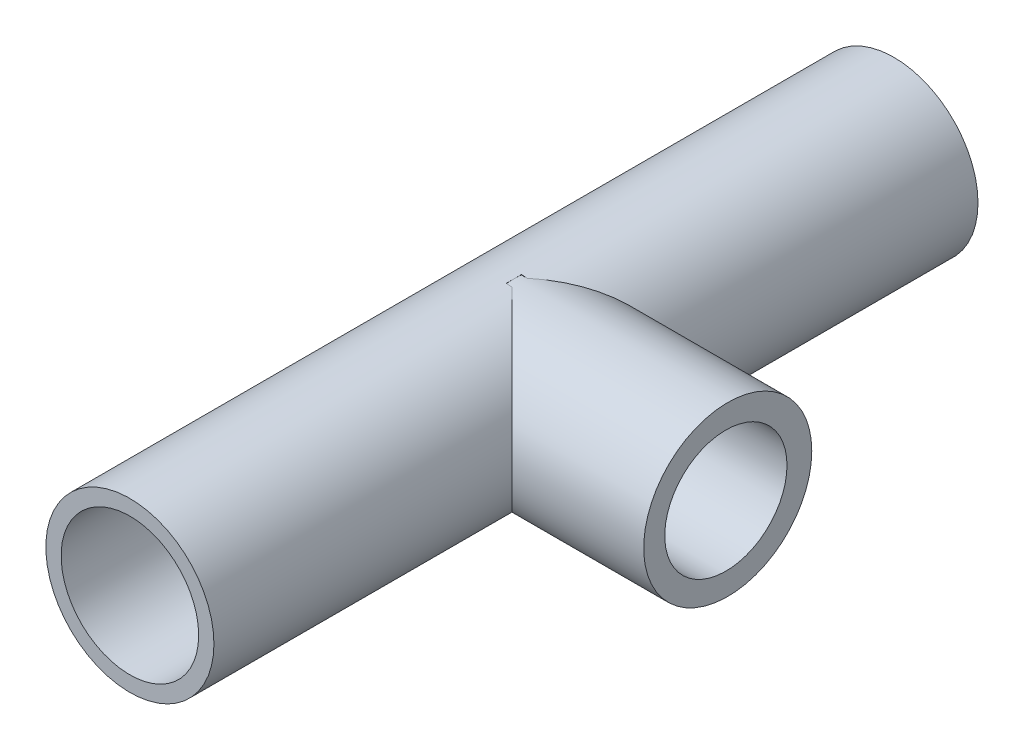
ISO-10303-21;
HEADER;
FILE_DESCRIPTION(('STEP AP214'),'2;1');
FILE_NAME('part.step','',(''),(''),'','','');
FILE_SCHEMA(('AUTOMOTIVE_DESIGN { 1 0 10303 214 1 1 1 1 }'));
ENDSEC;
DATA;
#1=APPLICATION_CONTEXT('core data for automotive mechanical design processes');
#2=APPLICATION_PROTOCOL_DEFINITION('international standard','automotive_design',2000,#1);
#3=PRODUCT_CONTEXT('',#1,'mechanical');
#4=PRODUCT('Part','Part','',(#3));
#5=PRODUCT_RELATED_PRODUCT_CATEGORY('part','',(#4));
#6=PRODUCT_DEFINITION_FORMATION('','',#4);
#7=PRODUCT_DEFINITION_CONTEXT('part definition',#1,'design');
#8=PRODUCT_DEFINITION('design','',#6,#7);
#9=PRODUCT_DEFINITION_SHAPE('','',#8);
#10=(LENGTH_UNIT() NAMED_UNIT(*) SI_UNIT(.MILLI.,.METRE.));
#11=(NAMED_UNIT(*) PLANE_ANGLE_UNIT() SI_UNIT($,.RADIAN.));
#12=(NAMED_UNIT(*) SI_UNIT($,.STERADIAN.) SOLID_ANGLE_UNIT());
#13=UNCERTAINTY_MEASURE_WITH_UNIT(LENGTH_MEASURE(1.E-05),#10,'distance_accuracy_value','');
#14=(GEOMETRIC_REPRESENTATION_CONTEXT(3) GLOBAL_UNCERTAINTY_ASSIGNED_CONTEXT((#13)) GLOBAL_UNIT_ASSIGNED_CONTEXT((#10,
#11,#12)) REPRESENTATION_CONTEXT('',''));
#15=CARTESIAN_POINT('',(0.,0.,0.));
#16=DIRECTION('',(0.,0.,1.));
#17=DIRECTION('',(1.,0.,0.));
#18=AXIS2_PLACEMENT_3D('',#15,#16,#17);
#19=CARTESIAN_POINT('',(0.,0.,100.));
#20=DIRECTION('',(0.,0.,-1.));
#21=DIRECTION('',(-1.,0.,0.));
#22=AXIS2_PLACEMENT_3D('',#19,#20,#21);
#23=CYLINDRICAL_SURFACE('',#22,11.);
#24=CARTESIAN_POINT('',(0.,0.,0.));
#25=DIRECTION('',(0.,0.,1.));
#26=DIRECTION('',(1.,0.,0.));
#27=AXIS2_PLACEMENT_3D('',#24,#25,#26);
#28=CIRCLE('',#27,11.);
#29=CARTESIAN_POINT('',(11.,0.,0.));
#30=VERTEX_POINT('',#29);
#31=EDGE_CURVE('E133',#30,#30,#28,.T.);
#32=ORIENTED_EDGE('',*,*,#31,.T.);
#33=EDGE_LOOP('',(#32));
#34=FACE_BOUND('',#33,.T.);
#35=CARTESIAN_POINT('',(0.,0.,100.));
#36=DIRECTION('',(0.,0.,1.));
#37=DIRECTION('',(1.,0.,0.));
#38=AXIS2_PLACEMENT_3D('',#35,#36,#37);
#39=CIRCLE('',#38,11.);
#40=CARTESIAN_POINT('',(11.,0.,100.));
#41=VERTEX_POINT('',#40);
#42=EDGE_CURVE('E130',#41,#41,#39,.T.);
#43=ORIENTED_EDGE('',*,*,#42,.F.);
#44=EDGE_LOOP('',(#43));
#45=FACE_BOUND('',#44,.T.);
#46=CARTESIAN_POINT('',(0.,0.,50.));
#47=DIRECTION('',(-0.707106781186547,0.,-0.707106781186547));
#48=DIRECTION('',(0.707106781186547,0.,-0.707106781186547));
#49=AXIS2_PLACEMENT_3D('',#46,#47,#48);
#50=ELLIPSE('',#49,15.556349186104,11.);
#51=CARTESIAN_POINT('',(1.00000000000007,-10.9544511501033,49.));
#52=VERTEX_POINT('',#51);
#53=CARTESIAN_POINT('',(1.00000000000007,10.9544511501033,49.));
#54=VERTEX_POINT('',#53);
#55=EDGE_CURVE('E238',#52,#54,#50,.F.);
#56=ORIENTED_EDGE('',*,*,#55,.F.);
#57=CARTESIAN_POINT('',(0.,0.,49.));
#58=DIRECTION('',(0.,0.,1.));
#59=DIRECTION('',(1.,0.,0.));
#60=AXIS2_PLACEMENT_3D('',#57,#58,#59);
#61=CIRCLE('',#60,11.);
#62=CARTESIAN_POINT('',(0.245082493247842,-10.9972694143366,49.));
#63=VERTEX_POINT('',#62);
#64=EDGE_CURVE('E259',#63,#52,#61,.T.);
#65=ORIENTED_EDGE('',*,*,#64,.F.);
#66=DIRECTION('',(0.,0.,-1.));
#67=VECTOR('',#66,1.);
#68=CARTESIAN_POINT('',(0.245082493247843,-10.9972694143366,100.));
#69=LINE('',#68,#67);
#70=CARTESIAN_POINT('',(0.245082493247843,-10.9972694143366,49.7549175067525));
#71=VERTEX_POINT('',#70);
#72=EDGE_CURVE('E261',#63,#71,#69,.F.);
#73=ORIENTED_EDGE('',*,*,#72,.T.);
#74=CARTESIAN_POINT('',(0.245082493247843,0.,50.));
#75=DIRECTION('',(1.,0.,0.));
#76=DIRECTION('',(0.,-0.999751764939692,0.0222802266588629));
#77=AXIS2_PLACEMENT_3D('',#74,#75,#76);
#78=CIRCLE('',#77,11.);
#79=CARTESIAN_POINT('',(0.245082493247843,-10.9972694143366,50.2450824932475));
#80=VERTEX_POINT('',#79);
#81=EDGE_CURVE('E245',#80,#71,#78,.T.);
#82=ORIENTED_EDGE('',*,*,#81,.F.);
#83=CARTESIAN_POINT('',(0.245082493247842,-10.9972694143366,51.));
#84=VERTEX_POINT('',#83);
#85=EDGE_CURVE('E41',#80,#84,#69,.F.);
#86=ORIENTED_EDGE('',*,*,#85,.T.);
#87=CARTESIAN_POINT('',(0.,0.,51.));
#88=DIRECTION('',(0.,0.,1.));
#89=DIRECTION('',(1.,0.,0.));
#90=AXIS2_PLACEMENT_3D('',#87,#88,#89);
#91=CIRCLE('',#90,11.);
#92=CARTESIAN_POINT('',(1.00000000000007,-10.9544511501033,51.));
#93=VERTEX_POINT('',#92);
#94=EDGE_CURVE('E112',#84,#93,#91,.T.);
#95=ORIENTED_EDGE('',*,*,#94,.T.);
#96=CARTESIAN_POINT('',(0.,0.,50.));
#97=DIRECTION('',(0.707106781186547,0.,-0.707106781186547));
#98=DIRECTION('',(-0.707106781186547,0.,-0.707106781186547));
#99=AXIS2_PLACEMENT_3D('',#96,#97,#98);
#100=ELLIPSE('',#99,15.556349186104,11.);
#101=CARTESIAN_POINT('',(1.00000000000007,10.9544511501033,51.));
#102=VERTEX_POINT('',#101);
#103=EDGE_CURVE('E129',#102,#93,#100,.T.);
#104=ORIENTED_EDGE('',*,*,#103,.F.);
#105=CARTESIAN_POINT('',(0.245082493247842,10.9972694143366,51.));
#106=VERTEX_POINT('',#105);
#107=EDGE_CURVE('E256',#102,#106,#91,.T.);
#108=ORIENTED_EDGE('',*,*,#107,.T.);
#109=DIRECTION('',(0.,0.,-1.));
#110=VECTOR('',#109,1.);
#111=CARTESIAN_POINT('',(0.245082493247843,10.9972694143366,100.));
#112=LINE('',#111,#110);
#113=CARTESIAN_POINT('',(0.245082493247843,10.9972694143366,50.2450824932475));
#114=VERTEX_POINT('',#113);
#115=EDGE_CURVE('E145',#106,#114,#112,.T.);
#116=ORIENTED_EDGE('',*,*,#115,.T.);
#117=CARTESIAN_POINT('',(0.245082493247843,0.,50.));
#118=DIRECTION('',(1.,0.,0.));
#119=DIRECTION('',(0.,0.999751764939692,-0.0222802266588636));
#120=AXIS2_PLACEMENT_3D('',#117,#118,#119);
#121=CIRCLE('',#120,11.);
#122=CARTESIAN_POINT('',(0.245082493247843,10.9972694143366,49.7549175067525));
#123=VERTEX_POINT('',#122);
#124=EDGE_CURVE('E140',#123,#114,#121,.T.);
#125=ORIENTED_EDGE('',*,*,#124,.F.);
#126=CARTESIAN_POINT('',(0.245082493247842,10.9972694143366,49.));
#127=VERTEX_POINT('',#126);
#128=EDGE_CURVE('E55',#123,#127,#112,.T.);
#129=ORIENTED_EDGE('',*,*,#128,.T.);
#130=EDGE_CURVE('E255',#54,#127,#61,.T.);
#131=ORIENTED_EDGE('',*,*,#130,.F.);
#132=EDGE_LOOP('',(#56,#65,#73,#82,#86,#95,#104,#108,#116,#125,#129,#131));
#133=FACE_BOUND('',#132,.T.);
#134=ADVANCED_FACE('F37',(#34,#45,#133),#23,.T.);
#135=CARTESIAN_POINT('',(0.,0.,100.));
#136=DIRECTION('',(0.,0.,-1.));
#137=DIRECTION('',(-1.,0.,0.));
#138=AXIS2_PLACEMENT_3D('',#135,#136,#137);
#139=CYLINDRICAL_SURFACE('',#138,9.);
#140=CARTESIAN_POINT('',(9.,0.,42.2431805977981));
#141=CARTESIAN_POINT('',(8.9999982147557,-0.186012270472923,42.2431824056281));
#142=CARTESIAN_POINT('',(8.99422012657772,-0.372061894134603,42.2496812424511));
#143=CARTESIAN_POINT('',(8.9712315702552,-0.74263329297767,42.2755567260639));
#144=CARTESIAN_POINT('',(8.95401453623935,-0.927154129023269,42.294940768871));
#145=CARTESIAN_POINT('',(8.90849354673416,-1.29338749112095,42.3462572841534));
#146=CARTESIAN_POINT('',(8.88016999644761,-1.47509446056546,42.3782119347878));
#147=CARTESIAN_POINT('',(8.8130298798314,-1.83408642791194,42.4540979685192));
#148=CARTESIAN_POINT('',(8.77420836877132,-2.01136929889185,42.4980349956166));
#149=CARTESIAN_POINT('',(8.68717642125768,-2.35899028939158,42.5967714110848));
#150=CARTESIAN_POINT('',(8.63903810977974,-2.52937031750564,42.6514874099155));
#151=CARTESIAN_POINT('',(8.53402320683388,-2.86377023574463,42.7712077317572));
#152=CARTESIAN_POINT('',(8.47714277687146,-3.02778729219915,42.8362165745363));
#153=CARTESIAN_POINT('',(8.3555897708379,-3.34866274008045,42.9756468445696));
#154=CARTESIAN_POINT('',(8.29092073648236,-3.5055243409044,43.0500639943399));
#155=CARTESIAN_POINT('',(8.15467355444471,-3.81174485081793,43.2075385912707));
#156=CARTESIAN_POINT('',(8.08309386878562,-3.96110207849971,43.2905979620932));
#157=CARTESIAN_POINT('',(7.90459748615449,-4.30919674417141,43.4988077017555));
#158=CARTESIAN_POINT('',(7.79484824014842,-4.50427420262921,43.6276719662957));
#159=CARTESIAN_POINT('',(7.56602975415553,-4.87887171147667,43.898883183037));
#160=CARTESIAN_POINT('',(7.44696028125135,-5.05839137283245,44.0412304722047));
#161=CARTESIAN_POINT('',(7.20139040924066,-5.40228844634357,44.3383484078678));
#162=CARTESIAN_POINT('',(7.07487257698273,-5.56662781787219,44.4931485379982));
#163=CARTESIAN_POINT('',(6.81684051322006,-5.87978242392109,44.8137809826376));
#164=CARTESIAN_POINT('',(6.68532694799833,-6.02859971877947,44.979611828176));
#165=CARTESIAN_POINT('',(6.41647402575206,-6.31412404131508,45.3255315794351));
#166=CARTESIAN_POINT('',(6.27907017109693,-6.45048248949408,45.5058576138049));
#167=CARTESIAN_POINT('',(6.0038358578962,-6.70741321924818,45.8772195298596));
#168=CARTESIAN_POINT('',(5.86600528614521,-6.82798086347553,46.0682585342459));
#169=CARTESIAN_POINT('',(5.59331804011493,-7.05308210397108,46.4609617805592));
#170=CARTESIAN_POINT('',(5.45845632377875,-7.15764502697451,46.6626056564258));
#171=CARTESIAN_POINT('',(5.19565394661048,-7.3506262141139,47.0776406865542));
#172=CARTESIAN_POINT('',(5.06770849211157,-7.43905576394602,47.2910234920922));
#173=CARTESIAN_POINT('',(4.82328054177641,-7.59983838873876,47.7335001225224));
#174=CARTESIAN_POINT('',(4.70693376045288,-7.67201133089423,47.9627363752648));
#175=CARTESIAN_POINT('',(4.49665140178865,-7.79711987207939,48.436329837394));
#176=CARTESIAN_POINT('',(4.40268313143869,-7.85008359400457,48.6806643236514));
#177=CARTESIAN_POINT('',(4.26273683776934,-7.92681910091217,49.1427757377624));
#178=CARTESIAN_POINT('',(4.21140581460927,-7.95396071910935,49.3583051858002));
#179=CARTESIAN_POINT('',(4.14170765615813,-7.99048956372416,49.7959500959985));
#180=CARTESIAN_POINT('',(4.12326877827652,-7.99991543320198,50.0180501475701));
#181=CARTESIAN_POINT('',(4.12294424617802,-8.00008365418742,50.4628724746577));
#182=CARTESIAN_POINT('',(4.14115666227761,-7.9907758788213,50.6855948229062));
#183=CARTESIAN_POINT('',(4.21062766171909,-7.9543706554487,51.1245121600429));
#184=CARTESIAN_POINT('',(4.26195698473077,-7.92723512402644,51.3406921367396));
#185=CARTESIAN_POINT('',(4.37403768415555,-7.86579906756439,51.7113471681612));
#186=CARTESIAN_POINT('',(4.4294892365735,-7.83482971394289,51.8680773425133));
#187=CARTESIAN_POINT('',(4.55123659764981,-7.7647396230811,52.175450772632));
#188=CARTESIAN_POINT('',(4.61753917620501,-7.72561379285976,52.326090154748));
#189=CARTESIAN_POINT('',(4.75826794283686,-7.63974467714259,52.6218581395557));
#190=CARTESIAN_POINT('',(4.83272003444131,-7.59297685470654,52.7669670704255));
#191=CARTESIAN_POINT('',(4.98729515676827,-7.4923571382937,53.0516261454358));
#192=CARTESIAN_POINT('',(5.06742021459951,-7.43850270611213,53.1911742744264));
#193=CARTESIAN_POINT('',(5.2925492738406,-7.28143204951842,53.5670119536441));
#194=CARTESIAN_POINT('',(5.44149041015919,-7.17129008849775,53.7980716066678));
#195=CARTESIAN_POINT('',(5.7443481588242,-6.93108615361568,54.246264468888));
#196=CARTESIAN_POINT('',(5.89826804465158,-6.80101085475224,54.463388223458));
#197=CARTESIAN_POINT('',(6.20630899033364,-6.52112166227905,54.8841684464979));
#198=CARTESIAN_POINT('',(6.36042991482932,-6.37131746207805,55.0878314553122));
#199=CARTESIAN_POINT('',(6.66519646965124,-6.05176819697834,55.4815324051423));
#200=CARTESIAN_POINT('',(6.81584359895424,-5.88203193316977,55.671576300491));
#201=CARTESIAN_POINT('',(7.08239714846874,-5.55653673634248,56.0023465867928));
#202=CARTESIAN_POINT('',(7.19945976280785,-5.40426344884626,56.1455764287923));
#203=CARTESIAN_POINT('',(7.42750510403212,-5.08629891856154,56.4216829625225));
#204=CARTESIAN_POINT('',(7.53848772852791,-4.92060744992209,56.5545594799152));
#205=CARTESIAN_POINT('',(7.75243686655107,-4.57610909419838,56.8086171217953));
#206=CARTESIAN_POINT('',(7.85541585847587,-4.39732350329235,56.9298165256798));
#207=CARTESIAN_POINT('',(8.05170491986901,-4.02666062278009,57.159356565175));
#208=CARTESIAN_POINT('',(8.14501735245289,-3.8347865519346,57.2677003444557));
#209=CARTESIAN_POINT('',(8.3016875682996,-3.48012677765941,57.448707162924));
#210=CARTESIAN_POINT('',(8.36722244210699,-3.31968471615364,57.5240869965949));
#211=CARTESIAN_POINT('',(8.49008935581159,-2.99149892515894,57.6649597037609));
#212=CARTESIAN_POINT('',(8.54742321146547,-2.82375682270504,57.7304547659835));
#213=CARTESIAN_POINT('',(8.6529280341647,-2.48170423475431,57.8506764836757));
#214=CARTESIAN_POINT('',(8.70110182795644,-2.30739579555321,57.9054064613732));
#215=CARTESIAN_POINT('',(8.78741179672738,-1.95310783655607,58.003279747033));
#216=CARTESIAN_POINT('',(8.82554785070895,-1.77312824842773,58.0464229153249));
#217=CARTESIAN_POINT('',(8.89121249570336,-1.40750128598386,58.1206141965045));
#218=CARTESIAN_POINT('',(8.91866954663499,-1.22182438284747,58.1515807513228));
#219=CARTESIAN_POINT('',(8.96199824473173,-0.847407197914569,58.2004125043336));
#220=CARTESIAN_POINT('',(8.97786986569955,-0.658666909192032,58.2182776729008));
#221=CARTESIAN_POINT('',(8.99764752708407,-0.279828951681925,58.2405356053913));
#222=CARTESIAN_POINT('',(9.00155755475324,-0.0897317563862061,58.2449328586818));
#223=CARTESIAN_POINT('',(8.99732666217548,0.290148688551569,58.2401730706224));
#224=CARTESIAN_POINT('',(8.98918668859324,0.479931961683186,58.231017094033));
#225=CARTESIAN_POINT('',(8.96252823830688,0.837762110399934,58.2010040044952));
#226=CARTESIAN_POINT('',(8.94518156373252,1.00601039243844,58.1814677952079));
#227=CARTESIAN_POINT('',(8.90130604084772,1.33981146379641,58.1319942031424));
#228=CARTESIAN_POINT('',(8.87477417073984,1.50536334724899,58.1020533973892));
#229=CARTESIAN_POINT('',(8.81300965474952,1.83264554233583,58.0322372668455));
#230=CARTESIAN_POINT('',(8.7777793231327,1.99437685792985,57.9923645844514));
#231=CARTESIAN_POINT('',(8.69918468788428,2.31325926490474,57.9032234263358));
#232=CARTESIAN_POINT('',(8.65581730501765,2.47040859626757,57.8539513935797));
#233=CARTESIAN_POINT('',(8.55954481338789,2.78614507767594,57.7442824283353));
#234=CARTESIAN_POINT('',(8.50630513413151,2.94449368862667,57.6834927319066));
#235=CARTESIAN_POINT('',(8.39247300781842,3.2548044440851,57.553078722757));
#236=CARTESIAN_POINT('',(8.33187771245231,3.40676408373348,57.4834509872096));
#237=CARTESIAN_POINT('',(8.14026790041488,3.85232515688265,57.2623973319522));
#238=CARTESIAN_POINT('',(7.99937536479362,4.13578168631174,57.0987397484805));
#239=CARTESIAN_POINT('',(7.73472224305763,4.6074294874286,56.787709358078));
#240=CARTESIAN_POINT('',(7.61519073780139,4.80197198719364,56.6461325670747));
#241=CARTESIAN_POINT('',(7.36729554927214,5.17425498735537,56.3492212076819));
#242=CARTESIAN_POINT('',(7.23893104718345,5.3519939264327,56.1938853634488));
#243=CARTESIAN_POINT('',(6.97536996439124,5.69126861039635,55.8703147258023));
#244=CARTESIAN_POINT('',(6.84015096352845,5.85274523043438,55.702036528965));
#245=CARTESIAN_POINT('',(6.56575519317227,6.15898570770209,55.3540133977383));
#246=CARTESIAN_POINT('',(6.42657921130345,6.30375286227135,55.17427073658));
#247=CARTESIAN_POINT('',(6.14363026122481,6.5799520867759,54.7994597247293));
#248=CARTESIAN_POINT('',(5.99982507697288,6.71100208545946,54.6041343976569));
#249=CARTESIAN_POINT('',(5.71394628229423,6.95602248255392,54.2016281882354));
#250=CARTESIAN_POINT('',(5.57187365474325,7.06998356600061,53.9944409244906));
#251=CARTESIAN_POINT('',(5.29428593129938,7.2801584690573,53.5681780366315));
#252=CARTESIAN_POINT('',(5.15875033512923,7.37643084788169,53.3491448646483));
#253=CARTESIAN_POINT('',(4.89996069380545,7.55080374656642,52.8972221892074));
#254=CARTESIAN_POINT('',(4.77669073795954,7.62892798816761,52.6643512793192));
#255=CARTESIAN_POINT('',(4.56354658355611,7.75808477376989,52.2084143368371));
#256=CARTESIAN_POINT('',(4.47151302708202,7.81111775169895,51.9869502194371));
#257=CARTESIAN_POINT('',(4.31438074811735,7.89900859817943,51.5312308890357));
#258=CARTESIAN_POINT('',(4.24921347377495,7.93391278399824,51.2970099788427));
#259=CARTESIAN_POINT('',(4.1793348017231,7.97081227537939,50.9367922287774));
#260=CARTESIAN_POINT('',(4.16065356992071,7.98054977910019,50.8142391306147));
#261=CARTESIAN_POINT('',(4.13403973725635,7.99437003225348,50.5676314338459));
#262=CARTESIAN_POINT('',(4.12610562535225,7.99845357663291,50.4435770487954));
#263=CARTESIAN_POINT('',(4.12151504059823,8.00081994909454,50.1952526588343));
#264=CARTESIAN_POINT('',(4.12485417177876,7.99910503826772,50.0709827568536));
#265=CARTESIAN_POINT('',(4.14257489256343,7.98994173498818,49.8234466147706));
#266=CARTESIAN_POINT('',(4.15695796088969,7.98249257475084,49.7001805113052));
#267=CARTESIAN_POINT('',(4.19727093960668,7.96137337118175,49.447070874218));
#268=CARTESIAN_POINT('',(4.22394816851513,7.94729919757378,49.3173817249288));
#269=CARTESIAN_POINT('',(4.28737440872816,7.91326157453918,49.0612290053707));
#270=CARTESIAN_POINT('',(4.32413089524303,7.89329375328772,48.9347679055518));
#271=CARTESIAN_POINT('',(4.4060646480662,7.84785251225525,48.6851818638077));
#272=CARTESIAN_POINT('',(4.45126934333655,7.82236111472674,48.5620693291083));
#273=CARTESIAN_POINT('',(4.54832843960636,7.7663283668867,48.3197447037675));
#274=CARTESIAN_POINT('',(4.6001816655525,7.73578790866471,48.200531928549));
#275=CARTESIAN_POINT('',(4.75142857682897,7.64438680865434,47.8745652753487));
#276=CARTESIAN_POINT('',(4.85643072879832,7.57841860604612,47.6718386036226));
#277=CARTESIAN_POINT('',(5.07652955502335,7.43278721139336,47.2770412202264));
#278=CARTESIAN_POINT('',(5.19163429958013,7.35311302085356,47.0849792315362));
#279=CARTESIAN_POINT('',(5.42775138155472,7.18059427730117,46.7102421358894));
#280=CARTESIAN_POINT('',(5.54877204659465,7.08773078637376,46.5275810501802));
#281=CARTESIAN_POINT('',(5.79340543286961,6.88921487516775,46.1712908205364));
#282=CARTESIAN_POINT('',(5.91701740563851,6.78356610679535,45.9976591176697));
#283=CARTESIAN_POINT('',(6.17689393836512,6.54826003185802,45.6420741861098));
#284=CARTESIAN_POINT('',(6.31318595914182,6.41725796149959,45.4610287912919));
#285=CARTESIAN_POINT('',(6.58350551456503,6.1396265664218,45.1094536760772));
#286=CARTESIAN_POINT('',(6.71753265623387,5.99299456137129,44.9389257672337));
#287=CARTESIAN_POINT('',(6.98077143952346,5.68418253748508,44.6092666981162));
#288=CARTESIAN_POINT('',(7.10999099733944,5.52202980580435,44.4501163653384));
#289=CARTESIAN_POINT('',(7.36167742468719,5.18174584039033,44.1438444454494));
#290=CARTESIAN_POINT('',(7.48414311001131,5.00361181882845,43.9967249656294));
#291=CARTESIAN_POINT('',(7.69730402728617,4.66724427842571,43.7430069748747));
#292=CARTESIAN_POINT('',(7.78957733586263,4.51177967786978,43.6340594717838));
#293=CARTESIAN_POINT('',(7.96696056695203,4.19060581824417,43.4258916793227));
#294=CARTESIAN_POINT('',(8.05207209363939,4.02489886786969,43.3266692108077));
#295=CARTESIAN_POINT('',(8.21382326431699,3.68358011541691,43.1390161177575));
#296=CARTESIAN_POINT('',(8.29046530419928,3.50797113581461,43.0505824404934));
#297=CARTESIAN_POINT('',(8.43395332587044,3.1473892221543,42.8856523462433));
#298=CARTESIAN_POINT('',(8.50080117352797,2.96241808071745,42.8091536553703));
#299=CARTESIAN_POINT('',(8.61395082085443,2.61308137720273,42.6800490338111));
#300=CARTESIAN_POINT('',(8.66183135493744,2.44991495392211,42.6255780042089));
#301=CARTESIAN_POINT('',(8.74884467316087,2.11827508703617,42.5267804603626));
#302=CARTESIAN_POINT('',(8.7879791265769,1.94980266314851,42.4824520102689));
#303=CARTESIAN_POINT('',(8.85673805573386,1.60884254026114,42.4046770104542));
#304=CARTESIAN_POINT('',(8.88638246129858,1.43636408277064,42.371207653787));
#305=CARTESIAN_POINT('',(8.93569182528651,1.08824839186266,42.3155860833103));
#306=CARTESIAN_POINT('',(8.95536179982238,0.91261279227138,42.2934281809654));
#307=CARTESIAN_POINT('',(8.97986822636227,0.613985823058076,42.2658340050272));
#308=CARTESIAN_POINT('',(8.98740952839763,0.491484760484486,42.257347084917));
#309=CARTESIAN_POINT('',(8.99747646359787,0.24599463330803,42.2460192678794));
#310=CARTESIAN_POINT('',(9.00000118053953,0.123005483670745,42.2431794023232));
#311=CARTESIAN_POINT('',(9.,0.,42.2431805977981));
#312=B_SPLINE_CURVE_WITH_KNOTS('',3,(#140,#141,#142,#143,#144,#145,#146,#147,#148,#149,#150,
#151,#152,#153,#154,#155,#156,#157,#158,#159,#160,#161,#162,#163,#164,#165,#166,#167,#168,#169,
#170,#171,#172,#173,#174,#175,#176,#177,#178,#179,#180,#181,#182,#183,#184,#185,#186,#187,#188,
#189,#190,#191,#192,#193,#194,#195,#196,#197,#198,#199,#200,#201,#202,#203,#204,#205,#206,#207,
#208,#209,#210,#211,#212,#213,#214,#215,#216,#217,#218,#219,#220,#221,#222,#223,#224,#225,#226,
#227,#228,#229,#230,#231,#232,#233,#234,#235,#236,#237,#238,#239,#240,#241,#242,#243,#244,#245,
#246,#247,#248,#249,#250,#251,#252,#253,#254,#255,#256,#257,#258,#259,#260,#261,#262,#263,#264,
#265,#266,#267,#268,#269,#270,#271,#272,#273,#274,#275,#276,#277,#278,#279,#280,#281,#282,#283,
#284,#285,#286,#287,#288,#289,#290,#291,#292,#293,#294,#295,#296,#297,#298,#299,#300,#301,#302,
#303,#304,#305,#306,#307,#308,#309,#310,#311),.UNSPECIFIED.,.T.,.F.,(4,2,2,2,2,2,2,2,2,2,2,2,2,
2,2,2,2,2,2,2,2,2,2,2,2,2,2,2,2,2,2,2,2,2,2,2,2,2,2,2,2,2,2,2,2,2,2,2,2,2,2,2,2,2,2,2,2,2,2,2,2,
2,2,2,2,2,2,2,2,2,2,2,2,2,2,2,2,2,2,2,2,2,2,2,2,4),(0.,0.557900548476215,1.11612160476672,
1.67533197222721,2.23480619812118,2.79011106179834,3.34566044933026,3.90095815874992,
4.45637973673557,5.23006833797579,6.00377628027629,6.77937326541719,7.55486716956379,
8.34784100346848,9.14104719343522,9.93278206466857,10.7239609561627,11.5235169215533,
12.3218975413718,12.9888786327592,13.6544031535436,14.321710830484,14.9904486565306,
15.4970859499474,16.0040405451346,16.5126560655874,17.0214542548001,17.9086174694981,
18.7963763415068,19.6837006466441,20.570634612743,21.28880804659,22.0069935710382,
22.724035928746,23.4409025804487,24.0073588344731,24.5736894767669,25.1398450677879,
25.7060074830893,26.2758999264051,26.8457936583742,27.4154974024491,27.9851563921878,
28.4953634579402,29.0057385342501,29.5159779689727,30.0264108801141,30.55920215999,
31.0922004143168,32.1576283301665,32.9626568794272,33.7677601553427,34.5756921982825,
35.3834645354899,36.2097664269772,37.0365171012118,37.8604794257329,38.6833585974145,
39.4185008308413,40.1517554933526,40.5242876496688,40.8967674226267,41.2691019649198,
41.6414863694443,42.0403099796552,42.4394301783124,42.8398694583352,43.2402380625063,
43.9519977647349,44.6643313123253,45.3776982062293,46.0908618173158,46.8754408061671,
47.6601545572614,48.4435131858657,49.2270087328158,49.8597009238486,50.4922510181987,
51.1246217129648,51.7568717791839,52.2920058079575,52.8270376137425,53.360938326637,
53.8945702754586,54.2634292572513,54.6323556008254),.UNSPECIFIED.);
#313=CARTESIAN_POINT('',(9.,0.,42.2431805977981));
#314=VERTEX_POINT('',#313);
#315=EDGE_CURVE('E187',#314,#314,#312,.T.);
#316=ORIENTED_EDGE('',*,*,#315,.F.);
#317=EDGE_LOOP('',(#316));
#318=FACE_BOUND('',#317,.T.);
#319=CARTESIAN_POINT('',(0.,0.,100.));
#320=DIRECTION('',(0.,0.,1.));
#321=DIRECTION('',(1.,0.,0.));
#322=AXIS2_PLACEMENT_3D('',#319,#320,#321);
#323=CIRCLE('',#322,9.);
#324=CARTESIAN_POINT('',(9.,0.,100.));
#325=VERTEX_POINT('',#324);
#326=EDGE_CURVE('E159',#325,#325,#323,.T.);
#327=ORIENTED_EDGE('',*,*,#326,.T.);
#328=EDGE_LOOP('',(#327));
#329=FACE_BOUND('',#328,.T.);
#330=CARTESIAN_POINT('',(0.,0.,0.));
#331=DIRECTION('',(0.,0.,1.));
#332=DIRECTION('',(1.,0.,0.));
#333=AXIS2_PLACEMENT_3D('',#330,#331,#332);
#334=CIRCLE('',#333,9.);
#335=CARTESIAN_POINT('',(9.,0.,0.));
#336=VERTEX_POINT('',#335);
#337=EDGE_CURVE('E153',#336,#336,#334,.T.);
#338=ORIENTED_EDGE('',*,*,#337,.F.);
#339=EDGE_LOOP('',(#338));
#340=FACE_BOUND('',#339,.T.);
#341=ADVANCED_FACE('F168',(#318,#329,#340),#139,.F.);
#342=CARTESIAN_POINT('',(0.245082493247843,13.,49.));
#343=DIRECTION('',(-1.,0.,0.));
#344=DIRECTION('',(0.,0.,1.));
#345=AXIS2_PLACEMENT_3D('',#342,#343,#344);
#346=PLANE('',#345);
#347=CARTESIAN_POINT('',(0.245082493247843,0.,50.));
#348=DIRECTION('',(1.,0.,0.));
#349=DIRECTION('',(0.,0.,-1.));
#350=AXIS2_PLACEMENT_3D('',#347,#348,#349);
#351=CIRCLE('',#350,11.);
#352=CARTESIAN_POINT('',(0.245082493247843,10.9544511501033,49.));
#353=VERTEX_POINT('',#352);
#354=EDGE_CURVE('E235',#353,#123,#351,.T.);
#355=ORIENTED_EDGE('',*,*,#354,.F.);
#356=DIRECTION('',(0.,-1.,0.));
#357=VECTOR('',#356,1.);
#358=CARTESIAN_POINT('',(0.245082493247843,13.,49.));
#359=LINE('',#358,#357);
#360=EDGE_CURVE('E251',#127,#353,#359,.T.);
#361=ORIENTED_EDGE('',*,*,#360,.F.);
#362=ORIENTED_EDGE('',*,*,#128,.F.);
#363=EDGE_LOOP('',(#355,#361,#362));
#364=FACE_BOUND('',#363,.T.);
#365=ADVANCED_FACE('F170',(#364),#346,.F.);
#366=CARTESIAN_POINT('',(0.245082493247843,-10.9544511501033,51.));
#367=VERTEX_POINT('',#366);
#368=EDGE_CURVE('E118',#367,#80,#351,.T.);
#369=ORIENTED_EDGE('',*,*,#368,.F.);
#370=DIRECTION('',(0.,-1.,0.));
#371=VECTOR('',#370,1.);
#372=CARTESIAN_POINT('',(0.245082493247843,13.,51.));
#373=LINE('',#372,#371);
#374=EDGE_CURVE('E107',#367,#84,#373,.T.);
#375=ORIENTED_EDGE('',*,*,#374,.T.);
#376=ORIENTED_EDGE('',*,*,#85,.F.);
#377=EDGE_LOOP('',(#369,#375,#376));
#378=FACE_BOUND('',#377,.T.);
#379=ADVANCED_FACE('F119',(#378),#346,.F.);
#380=CARTESIAN_POINT('',(0.,0.,49.));
#381=DIRECTION('',(0.,0.,1.));
#382=DIRECTION('',(1.,0.,0.));
#383=AXIS2_PLACEMENT_3D('',#380,#381,#382);
#384=PLANE('',#383);
#385=ORIENTED_EDGE('',*,*,#360,.T.);
#386=DIRECTION('',(-1.,0.,0.));
#387=VECTOR('',#386,1.);
#388=CARTESIAN_POINT('',(28.2450824932478,10.9544511501033,49.));
#389=LINE('',#388,#387);
#390=EDGE_CURVE('E115',#353,#54,#389,.F.);
#391=ORIENTED_EDGE('',*,*,#390,.T.);
#392=ORIENTED_EDGE('',*,*,#130,.T.);
#393=EDGE_LOOP('',(#385,#391,#392));
#394=FACE_BOUND('',#393,.T.);
#395=ADVANCED_FACE('F210',(#394),#384,.T.);
#396=ORIENTED_EDGE('',*,*,#64,.T.);
#397=DIRECTION('',(-1.,0.,0.));
#398=VECTOR('',#397,1.);
#399=CARTESIAN_POINT('',(28.2450824932478,-10.9544511501033,49.));
#400=LINE('',#399,#398);
#401=CARTESIAN_POINT('',(0.245082493247843,-10.9544511501033,49.));
#402=VERTEX_POINT('',#401);
#403=EDGE_CURVE('E240',#52,#402,#400,.T.);
#404=ORIENTED_EDGE('',*,*,#403,.T.);
#405=EDGE_CURVE('E257',#402,#63,#359,.T.);
#406=ORIENTED_EDGE('',*,*,#405,.T.);
#407=EDGE_LOOP('',(#396,#404,#406));
#408=FACE_BOUND('',#407,.T.);
#409=ADVANCED_FACE('F273',(#408),#384,.T.);
#410=CARTESIAN_POINT('',(0.,0.,51.));
#411=DIRECTION('',(0.,0.,1.));
#412=DIRECTION('',(1.,0.,0.));
#413=AXIS2_PLACEMENT_3D('',#410,#411,#412);
#414=PLANE('',#413);
#415=DIRECTION('',(-1.,0.,0.));
#416=VECTOR('',#415,1.);
#417=CARTESIAN_POINT('',(28.2450824932478,10.9544511501033,51.));
#418=LINE('',#417,#416);
#419=CARTESIAN_POINT('',(0.245082493247843,10.9544511501033,51.));
#420=VERTEX_POINT('',#419);
#421=EDGE_CURVE('E11',#420,#102,#418,.F.);
#422=ORIENTED_EDGE('',*,*,#421,.F.);
#423=EDGE_CURVE('E114',#106,#420,#373,.T.);
#424=ORIENTED_EDGE('',*,*,#423,.F.);
#425=ORIENTED_EDGE('',*,*,#107,.F.);
#426=EDGE_LOOP('',(#422,#424,#425));
#427=FACE_BOUND('',#426,.T.);
#428=ADVANCED_FACE('F275',(#427),#414,.F.);
#429=DIRECTION('',(-1.,0.,0.));
#430=VECTOR('',#429,1.);
#431=CARTESIAN_POINT('',(28.2450824932478,-10.9544511501033,51.));
#432=LINE('',#431,#430);
#433=EDGE_CURVE('E47',#93,#367,#432,.T.);
#434=ORIENTED_EDGE('',*,*,#433,.F.);
#435=ORIENTED_EDGE('',*,*,#94,.F.);
#436=ORIENTED_EDGE('',*,*,#374,.F.);
#437=EDGE_LOOP('',(#434,#435,#436));
#438=FACE_BOUND('',#437,.T.);
#439=ADVANCED_FACE('F109',(#438),#414,.F.);
#440=CARTESIAN_POINT('',(0.,0.,100.));
#441=DIRECTION('',(0.,0.,1.));
#442=DIRECTION('',(1.,0.,0.));
#443=AXIS2_PLACEMENT_3D('',#440,#441,#442);
#444=PLANE('',#443);
#445=ORIENTED_EDGE('',*,*,#42,.T.);
#446=EDGE_LOOP('',(#445));
#447=FACE_BOUND('',#446,.T.);
#448=ORIENTED_EDGE('',*,*,#326,.F.);
#449=EDGE_LOOP('',(#448));
#450=FACE_BOUND('',#449,.T.);
#451=ADVANCED_FACE('F185',(#447,#450),#444,.T.);
#452=CARTESIAN_POINT('',(0.,0.,0.));
#453=DIRECTION('',(0.,0.,1.));
#454=DIRECTION('',(1.,0.,0.));
#455=AXIS2_PLACEMENT_3D('',#452,#453,#454);
#456=PLANE('',#455);
#457=ORIENTED_EDGE('',*,*,#31,.F.);
#458=EDGE_LOOP('',(#457));
#459=FACE_BOUND('',#458,.T.);
#460=ORIENTED_EDGE('',*,*,#337,.T.);
#461=EDGE_LOOP('',(#460));
#462=FACE_BOUND('',#461,.T.);
#463=ADVANCED_FACE('F166',(#459,#462),#456,.F.);
#464=EDGE_CURVE('E63',#114,#420,#351,.T.);
#465=ORIENTED_EDGE('',*,*,#464,.F.);
#466=ORIENTED_EDGE('',*,*,#115,.F.);
#467=ORIENTED_EDGE('',*,*,#423,.T.);
#468=EDGE_LOOP('',(#465,#466,#467));
#469=FACE_BOUND('',#468,.T.);
#470=ADVANCED_FACE('F178',(#469),#346,.F.);
#471=EDGE_CURVE('E123',#71,#402,#351,.T.);
#472=ORIENTED_EDGE('',*,*,#471,.F.);
#473=ORIENTED_EDGE('',*,*,#72,.F.);
#474=ORIENTED_EDGE('',*,*,#405,.F.);
#475=EDGE_LOOP('',(#472,#473,#474));
#476=FACE_BOUND('',#475,.T.);
#477=ADVANCED_FACE('F205',(#476),#346,.F.);
#478=CARTESIAN_POINT('',(28.2450824932478,0.,50.));
#479=DIRECTION('',(1.,0.,0.));
#480=DIRECTION('',(0.,0.,-1.));
#481=AXIS2_PLACEMENT_3D('',#478,#479,#480);
#482=PLANE('',#481);
#483=CARTESIAN_POINT('',(28.2450824932478,0.,50.2431805977981));
#484=DIRECTION('',(1.,0.,0.));
#485=DIRECTION('',(0.,0.,-1.));
#486=AXIS2_PLACEMENT_3D('',#483,#484,#485);
#487=CIRCLE('',#486,8.);
#488=CARTESIAN_POINT('',(28.2450824932478,0.,42.2431805977981));
#489=VERTEX_POINT('',#488);
#490=EDGE_CURVE('E194',#489,#489,#487,.T.);
#491=ORIENTED_EDGE('',*,*,#490,.F.);
#492=EDGE_LOOP('',(#491));
#493=FACE_BOUND('',#492,.T.);
#494=CARTESIAN_POINT('',(28.2450824932478,0.,50.));
#495=DIRECTION('',(1.,0.,0.));
#496=DIRECTION('',(0.,0.,-1.));
#497=AXIS2_PLACEMENT_3D('',#494,#495,#496);
#498=CIRCLE('',#497,11.);
#499=CARTESIAN_POINT('',(28.2450824932478,0.,39.));
#500=VERTEX_POINT('',#499);
#501=EDGE_CURVE('E195',#500,#500,#498,.T.);
#502=ORIENTED_EDGE('',*,*,#501,.T.);
#503=EDGE_LOOP('',(#502));
#504=FACE_BOUND('',#503,.T.);
#505=ADVANCED_FACE('F202',(#493,#504),#482,.T.);
#506=CARTESIAN_POINT('',(28.2450824932478,0.,50.));
#507=DIRECTION('',(-1.,0.,0.));
#508=DIRECTION('',(0.,0.,1.));
#509=AXIS2_PLACEMENT_3D('',#506,#507,#508);
#510=CYLINDRICAL_SURFACE('',#509,11.);
#511=ORIENTED_EDGE('',*,*,#390,.F.);
#512=ORIENTED_EDGE('',*,*,#354,.T.);
#513=ORIENTED_EDGE('',*,*,#124,.T.);
#514=ORIENTED_EDGE('',*,*,#464,.T.);
#515=ORIENTED_EDGE('',*,*,#421,.T.);
#516=ORIENTED_EDGE('',*,*,#103,.T.);
#517=ORIENTED_EDGE('',*,*,#433,.T.);
#518=ORIENTED_EDGE('',*,*,#368,.T.);
#519=ORIENTED_EDGE('',*,*,#81,.T.);
#520=ORIENTED_EDGE('',*,*,#471,.T.);
#521=ORIENTED_EDGE('',*,*,#403,.F.);
#522=ORIENTED_EDGE('',*,*,#55,.T.);
#523=EDGE_LOOP('',(#511,#512,#513,#514,#515,#516,#517,#518,#519,#520,#521,#522));
#524=FACE_BOUND('',#523,.T.);
#525=ORIENTED_EDGE('',*,*,#501,.F.);
#526=EDGE_LOOP('',(#525));
#527=FACE_BOUND('',#526,.T.);
#528=ADVANCED_FACE('F127',(#524,#527),#510,.T.);
#529=CARTESIAN_POINT('',(0.245082493247836,0.,50.2431805977981));
#530=DIRECTION('',(1.,0.,0.));
#531=DIRECTION('',(0.,0.,-1.));
#532=AXIS2_PLACEMENT_3D('',#529,#530,#531);
#533=CYLINDRICAL_SURFACE('',#532,8.);
#534=ORIENTED_EDGE('',*,*,#315,.T.);
#535=EDGE_LOOP('',(#534));
#536=FACE_BOUND('',#535,.T.);
#537=ORIENTED_EDGE('',*,*,#490,.T.);
#538=EDGE_LOOP('',(#537));
#539=FACE_BOUND('',#538,.T.);
#540=ADVANCED_FACE('F197',(#536,#539),#533,.F.);
#541=CLOSED_SHELL('',(#134,#341,#365,#379,#395,#409,#428,#439,#451,#463,#470,#477,#505,#528,#540));
#542=MANIFOLD_SOLID_BREP('B2',#541);
#543=ADVANCED_BREP_SHAPE_REPRESENTATION('',(#18,#542),#14);
#544=SHAPE_DEFINITION_REPRESENTATION(#9,#543);
ENDSEC;
END-ISO-10303-21;
